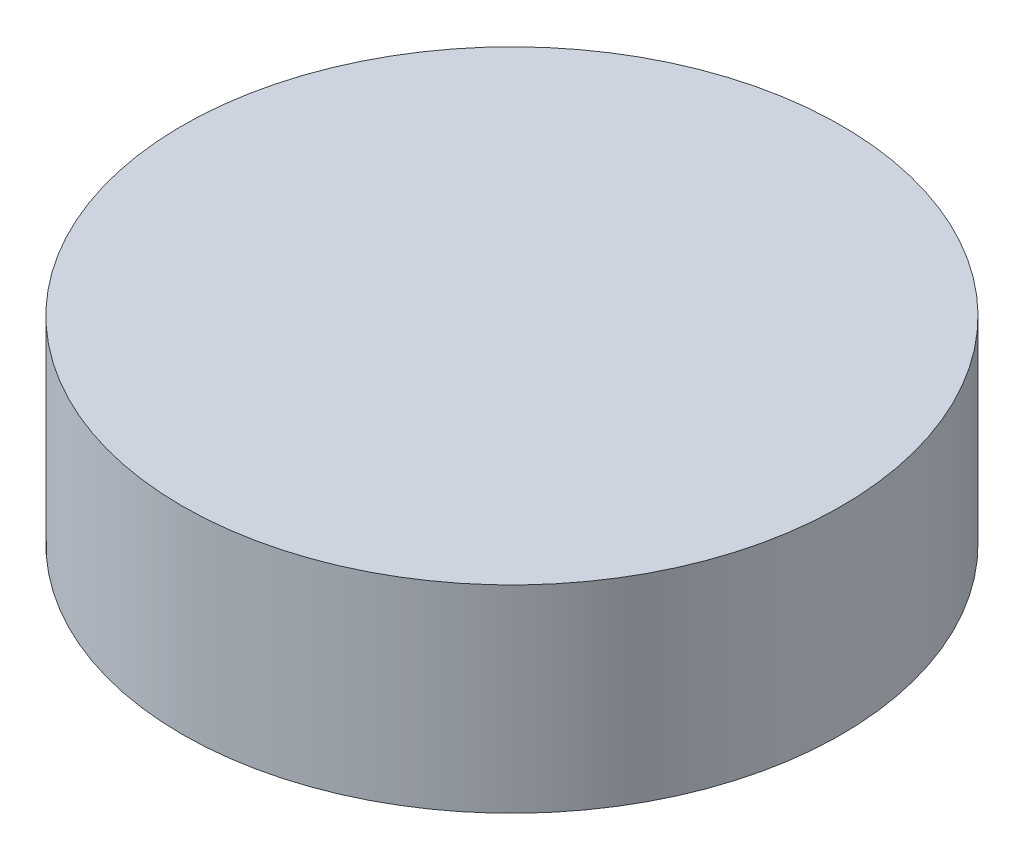
ISO-10303-21;
HEADER;
FILE_DESCRIPTION(('STEP AP214'),'2;1');
FILE_NAME('part.step','',(''),(''),'','','');
FILE_SCHEMA(('AUTOMOTIVE_DESIGN { 1 0 10303 214 1 1 1 1 }'));
ENDSEC;
DATA;
#1=APPLICATION_CONTEXT('core data for automotive mechanical design processes');
#2=APPLICATION_PROTOCOL_DEFINITION('international standard','automotive_design',2000,#1);
#3=PRODUCT_CONTEXT('',#1,'mechanical');
#4=PRODUCT('Part','Part','',(#3));
#5=PRODUCT_RELATED_PRODUCT_CATEGORY('part','',(#4));
#6=PRODUCT_DEFINITION_FORMATION('','',#4);
#7=PRODUCT_DEFINITION_CONTEXT('part definition',#1,'design');
#8=PRODUCT_DEFINITION('design','',#6,#7);
#9=PRODUCT_DEFINITION_SHAPE('','',#8);
#10=(LENGTH_UNIT() NAMED_UNIT(*) SI_UNIT(.MILLI.,.METRE.));
#11=(NAMED_UNIT(*) PLANE_ANGLE_UNIT() SI_UNIT($,.RADIAN.));
#12=(NAMED_UNIT(*) SI_UNIT($,.STERADIAN.) SOLID_ANGLE_UNIT());
#13=UNCERTAINTY_MEASURE_WITH_UNIT(LENGTH_MEASURE(1.E-05),#10,'distance_accuracy_value','');
#14=(GEOMETRIC_REPRESENTATION_CONTEXT(3) GLOBAL_UNCERTAINTY_ASSIGNED_CONTEXT((#13)) GLOBAL_UNIT_ASSIGNED_CONTEXT((#10,
#11,#12)) REPRESENTATION_CONTEXT('',''));
#15=CARTESIAN_POINT('',(0.,0.,0.));
#16=DIRECTION('',(0.,0.,1.));
#17=DIRECTION('',(1.,0.,0.));
#18=AXIS2_PLACEMENT_3D('',#15,#16,#17);
#19=CARTESIAN_POINT('',(0.,3.,0.));
#20=DIRECTION('',(0.,-1.,0.));
#21=DIRECTION('',(0.,0.,-1.));
#22=AXIS2_PLACEMENT_3D('',#19,#20,#21);
#23=CYLINDRICAL_SURFACE('',#22,5.);
#24=CARTESIAN_POINT('',(0.,3.,0.));
#25=DIRECTION('',(0.,1.,0.));
#26=DIRECTION('',(0.,0.,1.));
#27=AXIS2_PLACEMENT_3D('',#24,#25,#26);
#28=CIRCLE('',#27,5.);
#29=CARTESIAN_POINT('',(0.,3.,5.));
#30=VERTEX_POINT('',#29);
#31=EDGE_CURVE('E10',#30,#30,#28,.T.);
#32=ORIENTED_EDGE('',*,*,#31,.F.);
#33=EDGE_LOOP('',(#32));
#34=FACE_BOUND('',#33,.T.);
#35=CARTESIAN_POINT('',(0.,0.,0.));
#36=DIRECTION('',(0.,1.,0.));
#37=DIRECTION('',(0.,0.,1.));
#38=AXIS2_PLACEMENT_3D('',#35,#36,#37);
#39=CIRCLE('',#38,5.);
#40=CARTESIAN_POINT('',(0.,0.,5.));
#41=VERTEX_POINT('',#40);
#42=EDGE_CURVE('E34',#41,#41,#39,.T.);
#43=ORIENTED_EDGE('',*,*,#42,.T.);
#44=EDGE_LOOP('',(#43));
#45=FACE_BOUND('',#44,.T.);
#46=ADVANCED_FACE('F31',(#34,#45),#23,.T.);
#47=CARTESIAN_POINT('',(0.,3.,0.));
#48=DIRECTION('',(0.,1.,0.));
#49=DIRECTION('',(0.,0.,1.));
#50=AXIS2_PLACEMENT_3D('',#47,#48,#49);
#51=PLANE('',#50);
#52=ORIENTED_EDGE('',*,*,#31,.T.);
#53=EDGE_LOOP('',(#52));
#54=FACE_BOUND('',#53,.T.);
#55=ADVANCED_FACE('F46',(#54),#51,.T.);
#56=CARTESIAN_POINT('',(0.,0.,0.));
#57=DIRECTION('',(0.,1.,0.));
#58=DIRECTION('',(0.,0.,1.));
#59=AXIS2_PLACEMENT_3D('',#56,#57,#58);
#60=PLANE('',#59);
#61=ORIENTED_EDGE('',*,*,#42,.F.);
#62=EDGE_LOOP('',(#61));
#63=FACE_BOUND('',#62,.T.);
#64=ADVANCED_FACE('F44',(#63),#60,.F.);
#65=CLOSED_SHELL('',(#46,#55,#64));
#66=MANIFOLD_SOLID_BREP('B2',#65);
#67=ADVANCED_BREP_SHAPE_REPRESENTATION('',(#18,#66),#14);
#68=SHAPE_DEFINITION_REPRESENTATION(#9,#67);
ENDSEC;
END-ISO-10303-21;
